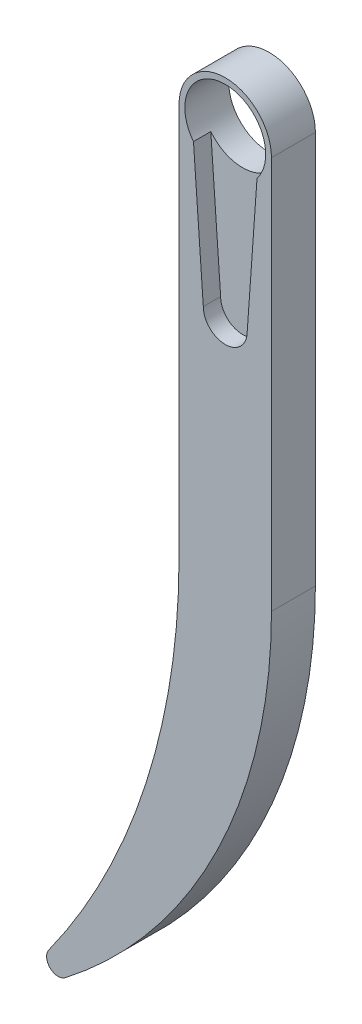
ISO-10303-21;
HEADER;
FILE_DESCRIPTION(('STEP AP214'),'2;1');
FILE_NAME('part.step','',(''),(''),'','','');
FILE_SCHEMA(('AUTOMOTIVE_DESIGN { 1 0 10303 214 1 1 1 1 }'));
ENDSEC;
DATA;
#1=APPLICATION_CONTEXT('core data for automotive mechanical design processes');
#2=APPLICATION_PROTOCOL_DEFINITION('international standard','automotive_design',2000,#1);
#3=PRODUCT_CONTEXT('',#1,'mechanical');
#4=PRODUCT('Part','Part','',(#3));
#5=PRODUCT_RELATED_PRODUCT_CATEGORY('part','',(#4));
#6=PRODUCT_DEFINITION_FORMATION('','',#4);
#7=PRODUCT_DEFINITION_CONTEXT('part definition',#1,'design');
#8=PRODUCT_DEFINITION('design','',#6,#7);
#9=PRODUCT_DEFINITION_SHAPE('','',#8);
#10=(LENGTH_UNIT() NAMED_UNIT(*) SI_UNIT(.MILLI.,.METRE.));
#11=(NAMED_UNIT(*) PLANE_ANGLE_UNIT() SI_UNIT($,.RADIAN.));
#12=(NAMED_UNIT(*) SI_UNIT($,.STERADIAN.) SOLID_ANGLE_UNIT());
#13=UNCERTAINTY_MEASURE_WITH_UNIT(LENGTH_MEASURE(1.E-05),#10,'distance_accuracy_value','');
#14=(GEOMETRIC_REPRESENTATION_CONTEXT(3) GLOBAL_UNCERTAINTY_ASSIGNED_CONTEXT((#13)) GLOBAL_UNIT_ASSIGNED_CONTEXT((#10,
#11,#12)) REPRESENTATION_CONTEXT('',''));
#15=CARTESIAN_POINT('',(0.,0.,0.));
#16=DIRECTION('',(0.,0.,1.));
#17=DIRECTION('',(1.,0.,0.));
#18=AXIS2_PLACEMENT_3D('',#15,#16,#17);
#19=CARTESIAN_POINT('',(0.,0.,3.8));
#20=DIRECTION('',(0.,0.,1.));
#21=DIRECTION('',(1.,0.,0.));
#22=AXIS2_PLACEMENT_3D('',#19,#20,#21);
#23=PLANE('',#22);
#24=DIRECTION('',(0.0710395464206788,0.997473499820594,0.));
#25=VECTOR('',#24,1.);
#26=CARTESIAN_POINT('',(1.90000000000001,65.9,3.8));
#27=LINE('',#26,#25);
#28=CARTESIAN_POINT('',(1.90000000000002,65.9,3.8));
#29=VERTEX_POINT('',#28);
#30=CARTESIAN_POINT('',(2.74999999999999,77.8349364905389,3.8));
#31=VERTEX_POINT('',#30);
#32=EDGE_CURVE('E128',#29,#31,#27,.T.);
#33=ORIENTED_EDGE('',*,*,#32,.F.);
#34=CARTESIAN_POINT('',(0.,65.9,3.8));
#35=DIRECTION('',(0.,0.,1.));
#36=DIRECTION('',(1.,0.,0.));
#37=AXIS2_PLACEMENT_3D('',#34,#35,#36);
#38=CIRCLE('',#37,1.90000000000001);
#39=CARTESIAN_POINT('',(-1.90000000000001,65.9000000000004,3.8));
#40=VERTEX_POINT('',#39);
#41=EDGE_CURVE('E356',#40,#29,#38,.T.);
#42=ORIENTED_EDGE('',*,*,#41,.F.);
#43=DIRECTION('',(0.0710395464206823,-0.997473499820594,0.));
#44=VECTOR('',#43,1.);
#45=CARTESIAN_POINT('',(-2.75000000000001,77.8349364905389,3.8));
#46=LINE('',#45,#44);
#47=CARTESIAN_POINT('',(-2.75000000000001,77.8349364905389,3.8));
#48=VERTEX_POINT('',#47);
#49=EDGE_CURVE('E357',#48,#40,#46,.T.);
#50=ORIENTED_EDGE('',*,*,#49,.F.);
#51=CARTESIAN_POINT('',(0.,80.,3.8));
#52=DIRECTION('',(0.,0.,1.));
#53=DIRECTION('',(1.,0.,0.));
#54=AXIS2_PLACEMENT_3D('',#51,#52,#53);
#55=CIRCLE('',#54,3.50000000000002);
#56=EDGE_CURVE('E134',#31,#48,#55,.T.);
#57=ORIENTED_EDGE('',*,*,#56,.F.);
#58=EDGE_LOOP('',(#33,#42,#50,#57));
#59=FACE_BOUND('',#58,.T.);
#60=CARTESIAN_POINT('',(-63.9999999999999,46.,3.8));
#61=DIRECTION('',(0.,0.,-1.));
#62=DIRECTION('',(1.,0.,0.));
#63=AXIS2_PLACEMENT_3D('',#60,#61,#62);
#64=CIRCLE('',#63,59.9999999999999);
#65=CARTESIAN_POINT('',(-4.,46.,3.8));
#66=VERTEX_POINT('',#65);
#67=CARTESIAN_POINT('',(-15.2711282008229,10.9928999604459,3.8));
#68=VERTEX_POINT('',#67);
#69=EDGE_CURVE('E148',#66,#68,#64,.T.);
#70=ORIENTED_EDGE('',*,*,#69,.T.);
#71=CARTESIAN_POINT('',(-14.4589803375032,10.40944829312,3.8));
#72=DIRECTION('',(0.,0.,1.));
#73=DIRECTION('',(1.,0.,0.));
#74=AXIS2_PLACEMENT_3D('',#71,#72,#73);
#75=CIRCLE('',#74,1.);
#76=CARTESIAN_POINT('',(-13.8469095028749,9.6186453509167,3.8));
#77=VERTEX_POINT('',#76);
#78=EDGE_CURVE('E182',#68,#77,#75,.T.);
#79=ORIENTED_EDGE('',*,*,#78,.T.);
#80=CARTESIAN_POINT('',(-42.0055883804883,45.9999999999999,3.8));
#81=DIRECTION('',(0.,0.,1.));
#82=DIRECTION('',(1.,0.,0.));
#83=AXIS2_PLACEMENT_3D('',#80,#81,#82);
#84=CIRCLE('',#83,46.0055883804883);
#85=CARTESIAN_POINT('',(4.,46.,3.8));
#86=VERTEX_POINT('',#85);
#87=EDGE_CURVE('E147',#77,#86,#84,.T.);
#88=ORIENTED_EDGE('',*,*,#87,.T.);
#89=DIRECTION('',(0.,1.,0.));
#90=VECTOR('',#89,1.);
#91=CARTESIAN_POINT('',(4.,0.,3.8));
#92=LINE('',#91,#90);
#93=CARTESIAN_POINT('',(4.,80.,3.8));
#94=VERTEX_POINT('',#93);
#95=EDGE_CURVE('E160',#86,#94,#92,.T.);
#96=ORIENTED_EDGE('',*,*,#95,.T.);
#97=CARTESIAN_POINT('',(0.,80.,3.8));
#98=DIRECTION('',(0.,0.,1.));
#99=DIRECTION('',(1.,0.,0.));
#100=AXIS2_PLACEMENT_3D('',#97,#98,#99);
#101=CIRCLE('',#100,4.);
#102=CARTESIAN_POINT('',(-4.,80.,3.8));
#103=VERTEX_POINT('',#102);
#104=EDGE_CURVE('E162',#94,#103,#101,.T.);
#105=ORIENTED_EDGE('',*,*,#104,.T.);
#106=DIRECTION('',(0.,-1.,0.));
#107=VECTOR('',#106,1.);
#108=CARTESIAN_POINT('',(-4.,0.,3.8));
#109=LINE('',#108,#107);
#110=EDGE_CURVE('E165',#103,#66,#109,.T.);
#111=ORIENTED_EDGE('',*,*,#110,.T.);
#112=EDGE_LOOP('',(#70,#79,#88,#96,#105,#111));
#113=FACE_BOUND('',#112,.T.);
#114=ADVANCED_FACE('F37',(#59,#113),#23,.T.);
#115=CARTESIAN_POINT('',(0.,0.,0.));
#116=DIRECTION('',(0.,0.,1.));
#117=DIRECTION('',(1.,0.,0.));
#118=AXIS2_PLACEMENT_3D('',#115,#116,#117);
#119=PLANE('',#118);
#120=CARTESIAN_POINT('',(0.,80.,0.));
#121=DIRECTION('',(0.,0.,1.));
#122=DIRECTION('',(1.,0.,0.));
#123=AXIS2_PLACEMENT_3D('',#120,#121,#122);
#124=CIRCLE('',#123,3.50000000000002);
#125=CARTESIAN_POINT('',(3.50000000000002,80.,0.));
#126=VERTEX_POINT('',#125);
#127=EDGE_CURVE('E142',#126,#126,#124,.T.);
#128=ORIENTED_EDGE('',*,*,#127,.T.);
#129=EDGE_LOOP('',(#128));
#130=FACE_BOUND('',#129,.T.);
#131=CARTESIAN_POINT('',(-42.0055883804883,45.9999999999999,0.));
#132=DIRECTION('',(0.,0.,1.));
#133=DIRECTION('',(1.,0.,0.));
#134=AXIS2_PLACEMENT_3D('',#131,#132,#133);
#135=CIRCLE('',#134,46.0055883804883);
#136=CARTESIAN_POINT('',(4.,46.,0.));
#137=VERTEX_POINT('',#136);
#138=CARTESIAN_POINT('',(-13.8469095028749,9.6186453509167,0.));
#139=VERTEX_POINT('',#138);
#140=EDGE_CURVE('E146',#137,#139,#135,.F.);
#141=ORIENTED_EDGE('',*,*,#140,.T.);
#142=CARTESIAN_POINT('',(-14.4589803375032,10.40944829312,0.));
#143=DIRECTION('',(0.,0.,1.));
#144=DIRECTION('',(1.,0.,0.));
#145=AXIS2_PLACEMENT_3D('',#142,#143,#144);
#146=CIRCLE('',#145,1.);
#147=CARTESIAN_POINT('',(-15.2711282008229,10.9928999604459,0.));
#148=VERTEX_POINT('',#147);
#149=EDGE_CURVE('E45',#139,#148,#146,.F.);
#150=ORIENTED_EDGE('',*,*,#149,.T.);
#151=CARTESIAN_POINT('',(-63.9999999999999,46.,0.));
#152=DIRECTION('',(0.,0.,1.));
#153=DIRECTION('',(1.,0.,0.));
#154=AXIS2_PLACEMENT_3D('',#151,#152,#153);
#155=CIRCLE('',#154,59.9999999999999);
#156=CARTESIAN_POINT('',(-4.,46.,0.));
#157=VERTEX_POINT('',#156);
#158=EDGE_CURVE('E144',#148,#157,#155,.T.);
#159=ORIENTED_EDGE('',*,*,#158,.T.);
#160=DIRECTION('',(0.,-1.,0.));
#161=VECTOR('',#160,1.);
#162=CARTESIAN_POINT('',(-4.,0.,0.));
#163=LINE('',#162,#161);
#164=CARTESIAN_POINT('',(-4.,80.,0.));
#165=VERTEX_POINT('',#164);
#166=EDGE_CURVE('E163',#165,#157,#163,.T.);
#167=ORIENTED_EDGE('',*,*,#166,.F.);
#168=CARTESIAN_POINT('',(0.,80.,0.));
#169=DIRECTION('',(0.,0.,1.));
#170=DIRECTION('',(1.,0.,0.));
#171=AXIS2_PLACEMENT_3D('',#168,#169,#170);
#172=CIRCLE('',#171,4.);
#173=CARTESIAN_POINT('',(4.,80.,0.));
#174=VERTEX_POINT('',#173);
#175=EDGE_CURVE('E170',#174,#165,#172,.T.);
#176=ORIENTED_EDGE('',*,*,#175,.F.);
#177=DIRECTION('',(0.,1.,0.));
#178=VECTOR('',#177,1.);
#179=CARTESIAN_POINT('',(4.,0.,0.));
#180=LINE('',#179,#178);
#181=EDGE_CURVE('E157',#137,#174,#180,.T.);
#182=ORIENTED_EDGE('',*,*,#181,.F.);
#183=EDGE_LOOP('',(#141,#150,#159,#167,#176,#182));
#184=FACE_BOUND('',#183,.T.);
#185=ADVANCED_FACE('F188',(#130,#184),#119,.F.);
#186=CARTESIAN_POINT('',(4.,0.,3.8));
#187=DIRECTION('',(-1.,0.,0.));
#188=DIRECTION('',(0.,0.,1.));
#189=AXIS2_PLACEMENT_3D('',#186,#187,#188);
#190=PLANE('',#189);
#191=ORIENTED_EDGE('',*,*,#95,.F.);
#192=DIRECTION('',(0.,0.,1.));
#193=VECTOR('',#192,1.);
#194=CARTESIAN_POINT('',(4.,46.,-50.6359556046887));
#195=LINE('',#194,#193);
#196=EDGE_CURVE('E153',#137,#86,#195,.T.);
#197=ORIENTED_EDGE('',*,*,#196,.F.);
#198=ORIENTED_EDGE('',*,*,#181,.T.);
#199=DIRECTION('',(0.,0.,-1.));
#200=VECTOR('',#199,1.);
#201=CARTESIAN_POINT('',(4.,80.,3.8));
#202=LINE('',#201,#200);
#203=EDGE_CURVE('E176',#94,#174,#202,.T.);
#204=ORIENTED_EDGE('',*,*,#203,.F.);
#205=EDGE_LOOP('',(#191,#197,#198,#204));
#206=FACE_BOUND('',#205,.T.);
#207=ADVANCED_FACE('F208',(#206),#190,.F.);
#208=CARTESIAN_POINT('',(0.,80.,3.8));
#209=DIRECTION('',(0.,0.,-1.));
#210=DIRECTION('',(-1.,0.,0.));
#211=AXIS2_PLACEMENT_3D('',#208,#209,#210);
#212=CYLINDRICAL_SURFACE('',#211,4.);
#213=ORIENTED_EDGE('',*,*,#175,.T.);
#214=DIRECTION('',(0.,0.,-1.));
#215=VECTOR('',#214,1.);
#216=CARTESIAN_POINT('',(-4.,80.,3.8));
#217=LINE('',#216,#215);
#218=EDGE_CURVE('E168',#103,#165,#217,.T.);
#219=ORIENTED_EDGE('',*,*,#218,.F.);
#220=ORIENTED_EDGE('',*,*,#104,.F.);
#221=ORIENTED_EDGE('',*,*,#203,.T.);
#222=EDGE_LOOP('',(#213,#219,#220,#221));
#223=FACE_BOUND('',#222,.T.);
#224=ADVANCED_FACE('F218',(#223),#212,.T.);
#225=CARTESIAN_POINT('',(-4.,0.,3.8));
#226=DIRECTION('',(1.,0.,0.));
#227=DIRECTION('',(0.,0.,-1.));
#228=AXIS2_PLACEMENT_3D('',#225,#226,#227);
#229=PLANE('',#228);
#230=ORIENTED_EDGE('',*,*,#166,.T.);
#231=DIRECTION('',(0.,0.,1.));
#232=VECTOR('',#231,1.);
#233=CARTESIAN_POINT('',(-4.,46.,-50.6359556046887));
#234=LINE('',#233,#232);
#235=EDGE_CURVE('E154',#157,#66,#234,.T.);
#236=ORIENTED_EDGE('',*,*,#235,.T.);
#237=ORIENTED_EDGE('',*,*,#110,.F.);
#238=ORIENTED_EDGE('',*,*,#218,.T.);
#239=EDGE_LOOP('',(#230,#236,#237,#238));
#240=FACE_BOUND('',#239,.T.);
#241=ADVANCED_FACE('F215',(#240),#229,.F.);
#242=CARTESIAN_POINT('',(-63.9999999999999,46.,-46.2806125845432));
#243=DIRECTION('',(0.,0.,1.));
#244=DIRECTION('',(1.,0.,0.));
#245=AXIS2_PLACEMENT_3D('',#242,#243,#244);
#246=CYLINDRICAL_SURFACE('',#245,59.9999999999999);
#247=ORIENTED_EDGE('',*,*,#158,.F.);
#248=DIRECTION('',(0.,0.,1.));
#249=VECTOR('',#248,1.);
#250=CARTESIAN_POINT('',(-15.2711282008228,10.9928999604459,-46.2806125845432));
#251=LINE('',#250,#249);
#252=EDGE_CURVE('E179',#148,#68,#251,.T.);
#253=ORIENTED_EDGE('',*,*,#252,.T.);
#254=ORIENTED_EDGE('',*,*,#69,.F.);
#255=ORIENTED_EDGE('',*,*,#235,.F.);
#256=EDGE_LOOP('',(#247,#253,#254,#255));
#257=FACE_BOUND('',#256,.T.);
#258=ADVANCED_FACE('F213',(#257),#246,.F.);
#259=CARTESIAN_POINT('',(-42.0055883804883,45.9999999999999,-46.2806125845432));
#260=DIRECTION('',(0.,0.,1.));
#261=DIRECTION('',(1.,0.,0.));
#262=AXIS2_PLACEMENT_3D('',#259,#260,#261);
#263=CYLINDRICAL_SURFACE('',#262,46.0055883804883);
#264=ORIENTED_EDGE('',*,*,#87,.F.);
#265=DIRECTION('',(0.,0.,1.));
#266=VECTOR('',#265,1.);
#267=CARTESIAN_POINT('',(-13.8469095028749,9.6186453509167,-46.2806125845432));
#268=LINE('',#267,#266);
#269=EDGE_CURVE('E59',#77,#139,#268,.F.);
#270=ORIENTED_EDGE('',*,*,#269,.T.);
#271=ORIENTED_EDGE('',*,*,#140,.F.);
#272=ORIENTED_EDGE('',*,*,#196,.T.);
#273=EDGE_LOOP('',(#264,#270,#271,#272));
#274=FACE_BOUND('',#273,.T.);
#275=ADVANCED_FACE('F198',(#274),#263,.T.);
#276=CARTESIAN_POINT('',(-14.4589803375032,10.40944829312,-46.2806125845432));
#277=DIRECTION('',(0.,0.,-1.));
#278=DIRECTION('',(-1.,0.,0.));
#279=AXIS2_PLACEMENT_3D('',#276,#277,#278);
#280=CYLINDRICAL_SURFACE('',#279,1.);
#281=ORIENTED_EDGE('',*,*,#149,.F.);
#282=ORIENTED_EDGE('',*,*,#269,.F.);
#283=ORIENTED_EDGE('',*,*,#78,.F.);
#284=ORIENTED_EDGE('',*,*,#252,.F.);
#285=EDGE_LOOP('',(#281,#282,#283,#284));
#286=FACE_BOUND('',#285,.T.);
#287=ADVANCED_FACE('F39',(#286),#280,.T.);
#288=CARTESIAN_POINT('',(0.,80.,-6.2));
#289=DIRECTION('',(0.,0.,1.));
#290=DIRECTION('',(1.,0.,0.));
#291=AXIS2_PLACEMENT_3D('',#288,#289,#290);
#292=CYLINDRICAL_SURFACE('',#291,3.50000000000002);
#293=DIRECTION('',(0.,0.,1.));
#294=VECTOR('',#293,1.);
#295=CARTESIAN_POINT('',(-2.75000000000001,77.8349364905389,2.3));
#296=LINE('',#295,#294);
#297=CARTESIAN_POINT('',(-2.75000000000001,77.8349364905389,2.3));
#298=VERTEX_POINT('',#297);
#299=EDGE_CURVE('E123',#298,#48,#296,.T.);
#300=ORIENTED_EDGE('',*,*,#299,.F.);
#301=CARTESIAN_POINT('',(0.,80.,2.3));
#302=DIRECTION('',(0.,0.,1.));
#303=DIRECTION('',(1.,0.,0.));
#304=AXIS2_PLACEMENT_3D('',#301,#302,#303);
#305=CIRCLE('',#304,3.50000000000002);
#306=CARTESIAN_POINT('',(2.75000000000001,77.8349364905389,2.3));
#307=VERTEX_POINT('',#306);
#308=EDGE_CURVE('E11',#307,#298,#305,.F.);
#309=ORIENTED_EDGE('',*,*,#308,.F.);
#310=DIRECTION('',(0.,0.,1.));
#311=VECTOR('',#310,1.);
#312=CARTESIAN_POINT('',(2.74999999999999,77.8349364905389,2.3));
#313=LINE('',#312,#311);
#314=EDGE_CURVE('E143',#307,#31,#313,.T.);
#315=ORIENTED_EDGE('',*,*,#314,.T.);
#316=ORIENTED_EDGE('',*,*,#56,.T.);
#317=EDGE_LOOP('',(#300,#309,#315,#316));
#318=FACE_BOUND('',#317,.T.);
#319=ORIENTED_EDGE('',*,*,#127,.F.);
#320=EDGE_LOOP('',(#319));
#321=FACE_BOUND('',#320,.T.);
#322=ADVANCED_FACE('F131',(#318,#321),#292,.F.);
#323=CARTESIAN_POINT('',(0.,80.,2.3));
#324=DIRECTION('',(0.,0.,1.));
#325=DIRECTION('',(1.,0.,0.));
#326=AXIS2_PLACEMENT_3D('',#323,#324,#325);
#327=PLANE('',#326);
#328=ORIENTED_EDGE('',*,*,#308,.T.);
#329=DIRECTION('',(0.0710395464206823,-0.997473499820594,0.));
#330=VECTOR('',#329,1.);
#331=CARTESIAN_POINT('',(-2.75000000000001,77.8349364905389,2.3));
#332=LINE('',#331,#330);
#333=CARTESIAN_POINT('',(-1.90000000000001,65.9000000000004,2.3));
#334=VERTEX_POINT('',#333);
#335=EDGE_CURVE('E116',#298,#334,#332,.T.);
#336=ORIENTED_EDGE('',*,*,#335,.T.);
#337=CARTESIAN_POINT('',(0.,65.9,2.3));
#338=DIRECTION('',(0.,0.,1.));
#339=DIRECTION('',(1.,0.,0.));
#340=AXIS2_PLACEMENT_3D('',#337,#338,#339);
#341=CIRCLE('',#340,1.90000000000001);
#342=CARTESIAN_POINT('',(1.90000000000002,65.9,2.3));
#343=VERTEX_POINT('',#342);
#344=EDGE_CURVE('E127',#334,#343,#341,.T.);
#345=ORIENTED_EDGE('',*,*,#344,.T.);
#346=DIRECTION('',(0.0710395464206788,0.997473499820594,0.));
#347=VECTOR('',#346,1.);
#348=CARTESIAN_POINT('',(1.90000000000001,65.9,2.3));
#349=LINE('',#348,#347);
#350=EDGE_CURVE('E51',#343,#307,#349,.T.);
#351=ORIENTED_EDGE('',*,*,#350,.T.);
#352=EDGE_LOOP('',(#328,#336,#345,#351));
#353=FACE_BOUND('',#352,.T.);
#354=ADVANCED_FACE('F115',(#353),#327,.T.);
#355=CARTESIAN_POINT('',(1.90000000000001,65.9,2.3));
#356=DIRECTION('',(0.997473499820594,-0.0710395464206787,0.));
#357=DIRECTION('',(0.0710395464206787,0.997473499820594,0.));
#358=AXIS2_PLACEMENT_3D('',#355,#356,#357);
#359=PLANE('',#358);
#360=ORIENTED_EDGE('',*,*,#32,.T.);
#361=ORIENTED_EDGE('',*,*,#314,.F.);
#362=ORIENTED_EDGE('',*,*,#350,.F.);
#363=DIRECTION('',(0.,0.,1.));
#364=VECTOR('',#363,1.);
#365=CARTESIAN_POINT('',(1.90000000000002,65.9,2.3));
#366=LINE('',#365,#364);
#367=EDGE_CURVE('E136',#343,#29,#366,.T.);
#368=ORIENTED_EDGE('',*,*,#367,.T.);
#369=EDGE_LOOP('',(#360,#361,#362,#368));
#370=FACE_BOUND('',#369,.T.);
#371=ADVANCED_FACE('F196',(#370),#359,.F.);
#372=CARTESIAN_POINT('',(0.,65.9,2.3));
#373=DIRECTION('',(0.,0.,1.));
#374=DIRECTION('',(1.,0.,0.));
#375=AXIS2_PLACEMENT_3D('',#372,#373,#374);
#376=CYLINDRICAL_SURFACE('',#375,1.90000000000001);
#377=ORIENTED_EDGE('',*,*,#41,.T.);
#378=ORIENTED_EDGE('',*,*,#367,.F.);
#379=ORIENTED_EDGE('',*,*,#344,.F.);
#380=DIRECTION('',(0.,0.,1.));
#381=VECTOR('',#380,1.);
#382=CARTESIAN_POINT('',(-1.90000000000001,65.9000000000004,2.3));
#383=LINE('',#382,#381);
#384=EDGE_CURVE('E125',#334,#40,#383,.T.);
#385=ORIENTED_EDGE('',*,*,#384,.T.);
#386=EDGE_LOOP('',(#377,#378,#379,#385));
#387=FACE_BOUND('',#386,.T.);
#388=ADVANCED_FACE('F286',(#387),#376,.F.);
#389=CARTESIAN_POINT('',(-2.75000000000001,77.8349364905389,2.3));
#390=DIRECTION('',(-0.997473499820594,-0.0710395464206823,0.));
#391=DIRECTION('',(0.0710395464206823,-0.997473499820594,0.));
#392=AXIS2_PLACEMENT_3D('',#389,#390,#391);
#393=PLANE('',#392);
#394=ORIENTED_EDGE('',*,*,#49,.T.);
#395=ORIENTED_EDGE('',*,*,#384,.F.);
#396=ORIENTED_EDGE('',*,*,#335,.F.);
#397=ORIENTED_EDGE('',*,*,#299,.T.);
#398=EDGE_LOOP('',(#394,#395,#396,#397));
#399=FACE_BOUND('',#398,.T.);
#400=ADVANCED_FACE('F122',(#399),#393,.F.);
#401=CLOSED_SHELL('',(#114,#185,#207,#224,#241,#258,#275,#287,#322,#354,#371,#388,#400));
#402=MANIFOLD_SOLID_BREP('B2',#401);
#403=ADVANCED_BREP_SHAPE_REPRESENTATION('',(#18,#402),#14);
#404=SHAPE_DEFINITION_REPRESENTATION(#9,#403);
ENDSEC;
END-ISO-10303-21;
